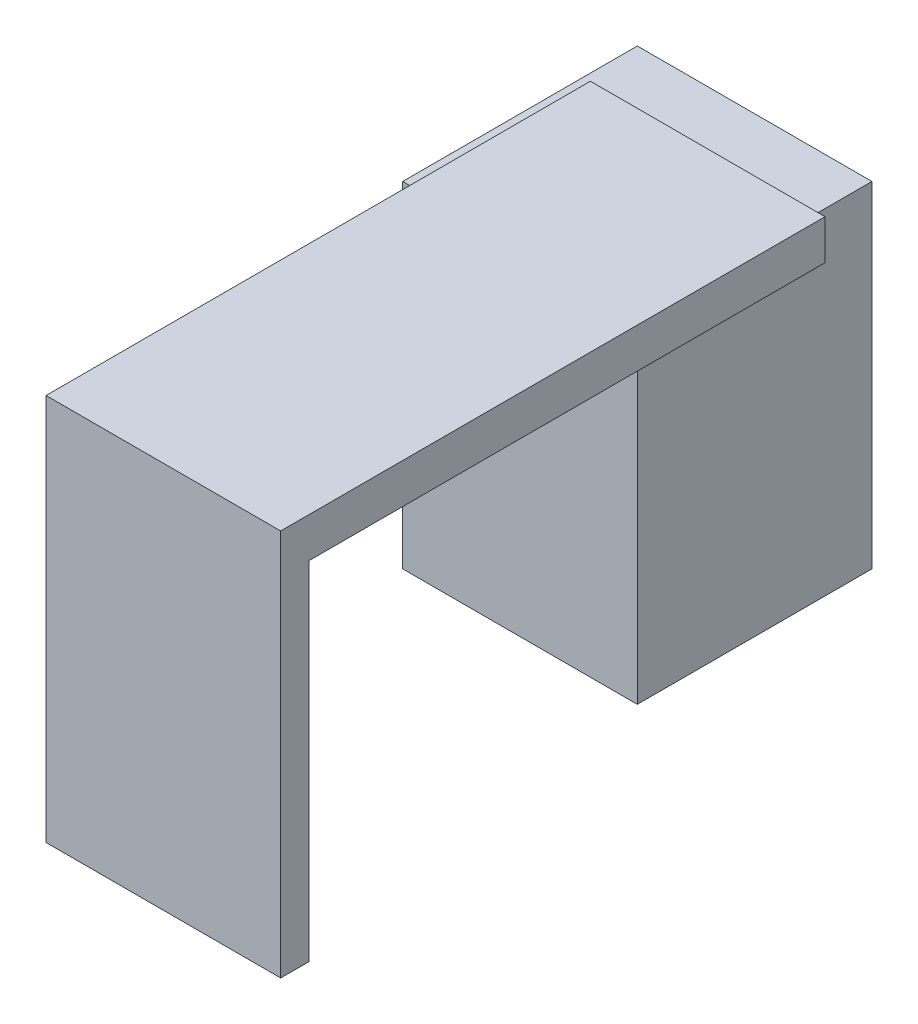
ISO-10303-21;
HEADER;
FILE_DESCRIPTION(('STEP AP214'),'2;1');
FILE_NAME('part.step','',(''),(''),'','','');
FILE_SCHEMA(('AUTOMOTIVE_DESIGN { 1 0 10303 214 1 1 1 1 }'));
ENDSEC;
DATA;
#1=APPLICATION_CONTEXT('core data for automotive mechanical design processes');
#2=APPLICATION_PROTOCOL_DEFINITION('international standard','automotive_design',2000,#1);
#3=PRODUCT_CONTEXT('',#1,'mechanical');
#4=PRODUCT('Part','Part','',(#3));
#5=PRODUCT_RELATED_PRODUCT_CATEGORY('part','',(#4));
#6=PRODUCT_DEFINITION_FORMATION('','',#4);
#7=PRODUCT_DEFINITION_CONTEXT('part definition',#1,'design');
#8=PRODUCT_DEFINITION('design','',#6,#7);
#9=PRODUCT_DEFINITION_SHAPE('','',#8);
#10=(LENGTH_UNIT() NAMED_UNIT(*) SI_UNIT(.MILLI.,.METRE.));
#11=(NAMED_UNIT(*) PLANE_ANGLE_UNIT() SI_UNIT($,.RADIAN.));
#12=(NAMED_UNIT(*) SI_UNIT($,.STERADIAN.) SOLID_ANGLE_UNIT());
#13=UNCERTAINTY_MEASURE_WITH_UNIT(LENGTH_MEASURE(1.E-05),#10,'distance_accuracy_value','');
#14=(GEOMETRIC_REPRESENTATION_CONTEXT(3) GLOBAL_UNCERTAINTY_ASSIGNED_CONTEXT((#13)) GLOBAL_UNIT_ASSIGNED_CONTEXT((#10,
#11,#12)) REPRESENTATION_CONTEXT('',''));
#15=CARTESIAN_POINT('',(0.,0.,0.));
#16=DIRECTION('',(0.,0.,1.));
#17=DIRECTION('',(1.,0.,0.));
#18=AXIS2_PLACEMENT_3D('',#15,#16,#17);
#19=CARTESIAN_POINT('',(250.,740.,-1160.));
#20=DIRECTION('',(0.,-1.,0.));
#21=DIRECTION('',(0.,0.,-1.));
#22=AXIS2_PLACEMENT_3D('',#19,#20,#21);
#23=PLANE('',#22);
#24=DIRECTION('',(0.,0.,-1.));
#25=VECTOR('',#24,1.);
#26=CARTESIAN_POINT('',(150.,740.,0.));
#27=LINE('',#26,#25);
#28=CARTESIAN_POINT('',(150.,740.,-860.));
#29=VERTEX_POINT('',#28);
#30=CARTESIAN_POINT('',(150.,740.,-1160.));
#31=VERTEX_POINT('',#30);
#32=EDGE_CURVE('E205',#29,#31,#27,.T.);
#33=ORIENTED_EDGE('',*,*,#32,.T.);
#34=DIRECTION('',(-1.,0.,0.));
#35=VECTOR('',#34,1.);
#36=CARTESIAN_POINT('',(250.,740.,-1160.));
#37=LINE('',#36,#35);
#38=CARTESIAN_POINT('',(250.,740.,-1160.));
#39=VERTEX_POINT('',#38);
#40=EDGE_CURVE('E11',#39,#31,#37,.T.);
#41=ORIENTED_EDGE('',*,*,#40,.F.);
#42=DIRECTION('',(0.,0.,1.));
#43=VECTOR('',#42,1.);
#44=CARTESIAN_POINT('',(250.,740.,-1160.));
#45=LINE('',#44,#43);
#46=CARTESIAN_POINT('',(250.,740.,-60.0000000000001));
#47=VERTEX_POINT('',#46);
#48=EDGE_CURVE('E151',#39,#47,#45,.T.);
#49=ORIENTED_EDGE('',*,*,#48,.T.);
#50=DIRECTION('',(-1.,0.,0.));
#51=VECTOR('',#50,1.);
#52=CARTESIAN_POINT('',(250.,740.,-60.0000000000001));
#53=LINE('',#52,#51);
#54=CARTESIAN_POINT('',(-250.,740.,-60.0000000000001));
#55=VERTEX_POINT('',#54);
#56=EDGE_CURVE('E38',#47,#55,#53,.T.);
#57=ORIENTED_EDGE('',*,*,#56,.T.);
#58=DIRECTION('',(0.,0.,1.));
#59=VECTOR('',#58,1.);
#60=CARTESIAN_POINT('',(-250.,740.,-1160.));
#61=LINE('',#60,#59);
#62=CARTESIAN_POINT('',(-250.,740.,-860.));
#63=VERTEX_POINT('',#62);
#64=EDGE_CURVE('E233',#63,#55,#61,.T.);
#65=ORIENTED_EDGE('',*,*,#64,.F.);
#66=DIRECTION('',(-1.,0.,0.));
#67=VECTOR('',#66,1.);
#68=CARTESIAN_POINT('',(0.,740.,-860.));
#69=LINE('',#68,#67);
#70=EDGE_CURVE('E51',#29,#63,#69,.T.);
#71=ORIENTED_EDGE('',*,*,#70,.F.);
#72=EDGE_LOOP('',(#33,#41,#49,#57,#65,#71));
#73=FACE_BOUND('',#72,.T.);
#74=ADVANCED_FACE('F35',(#73),#23,.T.);
#75=CARTESIAN_POINT('',(250.,800.,-1160.));
#76=DIRECTION('',(0.,0.,-1.));
#77=DIRECTION('',(-1.,0.,0.));
#78=AXIS2_PLACEMENT_3D('',#75,#76,#77);
#79=PLANE('',#78);
#80=DIRECTION('',(0.,-1.,0.));
#81=VECTOR('',#80,1.);
#82=CARTESIAN_POINT('',(-250.,800.,-1160.));
#83=LINE('',#82,#81);
#84=CARTESIAN_POINT('',(-250.,825.,-1160.));
#85=VERTEX_POINT('',#84);
#86=CARTESIAN_POINT('',(-250.,740.,-1160.));
#87=VERTEX_POINT('',#86);
#88=EDGE_CURVE('E144',#85,#87,#83,.T.);
#89=ORIENTED_EDGE('',*,*,#88,.F.);
#90=DIRECTION('',(-1.,0.,0.));
#91=VECTOR('',#90,1.);
#92=CARTESIAN_POINT('',(0.,825.,-1160.));
#93=LINE('',#92,#91);
#94=CARTESIAN_POINT('',(250.,825.,-1160.));
#95=VERTEX_POINT('',#94);
#96=EDGE_CURVE('E149',#95,#85,#93,.T.);
#97=ORIENTED_EDGE('',*,*,#96,.F.);
#98=DIRECTION('',(0.,-1.,0.));
#99=VECTOR('',#98,1.);
#100=CARTESIAN_POINT('',(250.,800.,-1160.));
#101=LINE('',#100,#99);
#102=EDGE_CURVE('E244',#95,#39,#101,.T.);
#103=ORIENTED_EDGE('',*,*,#102,.T.);
#104=ORIENTED_EDGE('',*,*,#40,.T.);
#105=DIRECTION('',(-1.,0.,0.));
#106=VECTOR('',#105,1.);
#107=CARTESIAN_POINT('',(250.,740.,-1160.));
#108=LINE('',#107,#106);
#109=EDGE_CURVE('E59',#31,#87,#108,.T.);
#110=ORIENTED_EDGE('',*,*,#109,.T.);
#111=EDGE_LOOP('',(#89,#97,#103,#104,#110));
#112=FACE_BOUND('',#111,.T.);
#113=ADVANCED_FACE('F146',(#112),#79,.T.);
#114=CARTESIAN_POINT('',(250.,0.,0.));
#115=DIRECTION('',(0.,0.,1.));
#116=DIRECTION('',(1.,0.,0.));
#117=AXIS2_PLACEMENT_3D('',#114,#115,#116);
#118=PLANE('',#117);
#119=DIRECTION('',(0.,1.,0.));
#120=VECTOR('',#119,1.);
#121=CARTESIAN_POINT('',(-250.,0.,0.));
#122=LINE('',#121,#120);
#123=CARTESIAN_POINT('',(-250.,0.,0.));
#124=VERTEX_POINT('',#123);
#125=CARTESIAN_POINT('',(-250.,825.,0.));
#126=VERTEX_POINT('',#125);
#127=EDGE_CURVE('E152',#124,#126,#122,.T.);
#128=ORIENTED_EDGE('',*,*,#127,.F.);
#129=DIRECTION('',(-1.,0.,0.));
#130=VECTOR('',#129,1.);
#131=CARTESIAN_POINT('',(250.,0.,0.));
#132=LINE('',#131,#130);
#133=CARTESIAN_POINT('',(250.,0.,0.));
#134=VERTEX_POINT('',#133);
#135=EDGE_CURVE('E43',#134,#124,#132,.T.);
#136=ORIENTED_EDGE('',*,*,#135,.F.);
#137=DIRECTION('',(0.,1.,0.));
#138=VECTOR('',#137,1.);
#139=CARTESIAN_POINT('',(250.,0.,0.));
#140=LINE('',#139,#138);
#141=CARTESIAN_POINT('',(250.,825.,0.));
#142=VERTEX_POINT('',#141);
#143=EDGE_CURVE('E242',#134,#142,#140,.T.);
#144=ORIENTED_EDGE('',*,*,#143,.T.);
#145=DIRECTION('',(1.,0.,0.));
#146=VECTOR('',#145,1.);
#147=CARTESIAN_POINT('',(0.,825.,0.));
#148=LINE('',#147,#146);
#149=EDGE_CURVE('E162',#126,#142,#148,.T.);
#150=ORIENTED_EDGE('',*,*,#149,.F.);
#151=EDGE_LOOP('',(#128,#136,#144,#150));
#152=FACE_BOUND('',#151,.T.);
#153=ADVANCED_FACE('F282',(#152),#118,.T.);
#154=CARTESIAN_POINT('',(250.,0.,-60.0000000000001));
#155=DIRECTION('',(0.,-1.,0.));
#156=DIRECTION('',(0.,0.,-1.));
#157=AXIS2_PLACEMENT_3D('',#154,#155,#156);
#158=PLANE('',#157);
#159=DIRECTION('',(0.,0.,1.));
#160=VECTOR('',#159,1.);
#161=CARTESIAN_POINT('',(-250.,0.,-60.0000000000001));
#162=LINE('',#161,#160);
#163=CARTESIAN_POINT('',(-250.,0.,-60.0000000000001));
#164=VERTEX_POINT('',#163);
#165=EDGE_CURVE('E251',#164,#124,#162,.T.);
#166=ORIENTED_EDGE('',*,*,#165,.F.);
#167=DIRECTION('',(-1.,0.,0.));
#168=VECTOR('',#167,1.);
#169=CARTESIAN_POINT('',(250.,0.,-60.0000000000001));
#170=LINE('',#169,#168);
#171=CARTESIAN_POINT('',(250.,0.,-60.0000000000001));
#172=VERTEX_POINT('',#171);
#173=EDGE_CURVE('E254',#172,#164,#170,.T.);
#174=ORIENTED_EDGE('',*,*,#173,.F.);
#175=DIRECTION('',(0.,0.,1.));
#176=VECTOR('',#175,1.);
#177=CARTESIAN_POINT('',(250.,0.,-60.0000000000001));
#178=LINE('',#177,#176);
#179=EDGE_CURVE('E239',#172,#134,#178,.T.);
#180=ORIENTED_EDGE('',*,*,#179,.T.);
#181=ORIENTED_EDGE('',*,*,#135,.T.);
#182=EDGE_LOOP('',(#166,#174,#180,#181));
#183=FACE_BOUND('',#182,.T.);
#184=ADVANCED_FACE('F280',(#183),#158,.T.);
#185=CARTESIAN_POINT('',(250.,740.,-60.0000000000001));
#186=DIRECTION('',(0.,0.,-1.));
#187=DIRECTION('',(0.,1.,0.));
#188=AXIS2_PLACEMENT_3D('',#185,#186,#187);
#189=PLANE('',#188);
#190=DIRECTION('',(0.,-1.,0.));
#191=VECTOR('',#190,1.);
#192=CARTESIAN_POINT('',(-250.,740.,-60.0000000000001));
#193=LINE('',#192,#191);
#194=EDGE_CURVE('E248',#55,#164,#193,.T.);
#195=ORIENTED_EDGE('',*,*,#194,.F.);
#196=ORIENTED_EDGE('',*,*,#56,.F.);
#197=DIRECTION('',(0.,-1.,0.));
#198=VECTOR('',#197,1.);
#199=CARTESIAN_POINT('',(250.,740.,-60.0000000000001));
#200=LINE('',#199,#198);
#201=EDGE_CURVE('E236',#47,#172,#200,.T.);
#202=ORIENTED_EDGE('',*,*,#201,.T.);
#203=ORIENTED_EDGE('',*,*,#173,.T.);
#204=EDGE_LOOP('',(#195,#196,#202,#203));
#205=FACE_BOUND('',#204,.T.);
#206=ADVANCED_FACE('F262',(#205),#189,.T.);
#207=CARTESIAN_POINT('',(250.,0.,0.));
#208=DIRECTION('',(1.,0.,0.));
#209=DIRECTION('',(0.,0.,-1.));
#210=AXIS2_PLACEMENT_3D('',#207,#208,#209);
#211=PLANE('',#210);
#212=ORIENTED_EDGE('',*,*,#48,.F.);
#213=ORIENTED_EDGE('',*,*,#102,.F.);
#214=DIRECTION('',(0.,0.,-1.));
#215=VECTOR('',#214,1.);
#216=CARTESIAN_POINT('',(250.,825.,0.));
#217=LINE('',#216,#215);
#218=EDGE_CURVE('E167',#142,#95,#217,.T.);
#219=ORIENTED_EDGE('',*,*,#218,.F.);
#220=ORIENTED_EDGE('',*,*,#143,.F.);
#221=ORIENTED_EDGE('',*,*,#179,.F.);
#222=ORIENTED_EDGE('',*,*,#201,.F.);
#223=EDGE_LOOP('',(#212,#213,#219,#220,#221,#222));
#224=FACE_BOUND('',#223,.T.);
#225=ADVANCED_FACE('F276',(#224),#211,.T.);
#226=CARTESIAN_POINT('',(-250.,0.,0.));
#227=DIRECTION('',(1.,0.,0.));
#228=DIRECTION('',(0.,0.,-1.));
#229=AXIS2_PLACEMENT_3D('',#226,#227,#228);
#230=PLANE('',#229);
#231=EDGE_CURVE('E246',#87,#63,#61,.T.);
#232=ORIENTED_EDGE('',*,*,#231,.T.);
#233=ORIENTED_EDGE('',*,*,#64,.T.);
#234=ORIENTED_EDGE('',*,*,#194,.T.);
#235=ORIENTED_EDGE('',*,*,#165,.T.);
#236=ORIENTED_EDGE('',*,*,#127,.T.);
#237=DIRECTION('',(0.,0.,1.));
#238=VECTOR('',#237,1.);
#239=CARTESIAN_POINT('',(-250.,825.,0.));
#240=LINE('',#239,#238);
#241=EDGE_CURVE('E155',#85,#126,#240,.T.);
#242=ORIENTED_EDGE('',*,*,#241,.F.);
#243=ORIENTED_EDGE('',*,*,#88,.T.);
#244=EDGE_LOOP('',(#232,#233,#234,#235,#236,#242,#243));
#245=FACE_BOUND('',#244,.T.);
#246=ADVANCED_FACE('F156',(#245),#230,.F.);
#247=CARTESIAN_POINT('',(250.,740.,-1160.));
#248=DIRECTION('',(0.,-1.,0.));
#249=DIRECTION('',(0.,0.,-1.));
#250=AXIS2_PLACEMENT_3D('',#247,#248,#249);
#251=PLANE('',#250);
#252=ORIENTED_EDGE('',*,*,#109,.F.);
#253=CARTESIAN_POINT('',(150.,740.,-1360.));
#254=VERTEX_POINT('',#253);
#255=EDGE_CURVE('E175',#31,#254,#27,.T.);
#256=ORIENTED_EDGE('',*,*,#255,.T.);
#257=DIRECTION('',(-1.,0.,0.));
#258=VECTOR('',#257,1.);
#259=CARTESIAN_POINT('',(0.,740.,-1360.));
#260=LINE('',#259,#258);
#261=CARTESIAN_POINT('',(-350.,740.,-1360.));
#262=VERTEX_POINT('',#261);
#263=EDGE_CURVE('E207',#254,#262,#260,.T.);
#264=ORIENTED_EDGE('',*,*,#263,.T.);
#265=DIRECTION('',(0.,0.,-1.));
#266=VECTOR('',#265,1.);
#267=CARTESIAN_POINT('',(-350.,740.,0.));
#268=LINE('',#267,#266);
#269=CARTESIAN_POINT('',(-350.,740.,-860.));
#270=VERTEX_POINT('',#269);
#271=EDGE_CURVE('E201',#270,#262,#268,.T.);
#272=ORIENTED_EDGE('',*,*,#271,.F.);
#273=EDGE_CURVE('E193',#63,#270,#69,.T.);
#274=ORIENTED_EDGE('',*,*,#273,.F.);
#275=ORIENTED_EDGE('',*,*,#231,.F.);
#276=EDGE_LOOP('',(#252,#256,#264,#272,#274,#275));
#277=FACE_BOUND('',#276,.T.);
#278=ADVANCED_FACE('F263',(#277),#251,.F.);
#279=CARTESIAN_POINT('',(150.,1447.10678118655,0.));
#280=DIRECTION('',(1.,0.,0.));
#281=DIRECTION('',(0.,0.,-1.));
#282=AXIS2_PLACEMENT_3D('',#279,#280,#281);
#283=PLANE('',#282);
#284=ORIENTED_EDGE('',*,*,#32,.F.);
#285=DIRECTION('',(0.,-1.,0.));
#286=VECTOR('',#285,1.);
#287=CARTESIAN_POINT('',(150.,1447.10678118655,-860.));
#288=LINE('',#287,#286);
#289=CARTESIAN_POINT('',(150.,25.,-860.));
#290=VERTEX_POINT('',#289);
#291=EDGE_CURVE('E180',#29,#290,#288,.T.);
#292=ORIENTED_EDGE('',*,*,#291,.T.);
#293=DIRECTION('',(0.,0.,1.));
#294=VECTOR('',#293,1.);
#295=CARTESIAN_POINT('',(150.,25.,0.));
#296=LINE('',#295,#294);
#297=CARTESIAN_POINT('',(150.,25.,-1360.));
#298=VERTEX_POINT('',#297);
#299=EDGE_CURVE('E188',#298,#290,#296,.T.);
#300=ORIENTED_EDGE('',*,*,#299,.F.);
#301=DIRECTION('',(0.,-1.,0.));
#302=VECTOR('',#301,1.);
#303=CARTESIAN_POINT('',(150.,1447.10678118655,-1360.));
#304=LINE('',#303,#302);
#305=EDGE_CURVE('E199',#254,#298,#304,.T.);
#306=ORIENTED_EDGE('',*,*,#305,.F.);
#307=ORIENTED_EDGE('',*,*,#255,.F.);
#308=EDGE_LOOP('',(#284,#292,#300,#306,#307));
#309=FACE_BOUND('',#308,.T.);
#310=ADVANCED_FACE('F272',(#309),#283,.T.);
#311=CARTESIAN_POINT('',(0.,1447.10678118655,-1360.));
#312=DIRECTION('',(0.,0.,-1.));
#313=DIRECTION('',(-1.,0.,0.));
#314=AXIS2_PLACEMENT_3D('',#311,#312,#313);
#315=PLANE('',#314);
#316=ORIENTED_EDGE('',*,*,#263,.F.);
#317=ORIENTED_EDGE('',*,*,#305,.T.);
#318=DIRECTION('',(1.,0.,0.));
#319=VECTOR('',#318,1.);
#320=CARTESIAN_POINT('',(0.,25.,-1360.));
#321=LINE('',#320,#319);
#322=CARTESIAN_POINT('',(-350.,25.,-1360.));
#323=VERTEX_POINT('',#322);
#324=EDGE_CURVE('E184',#323,#298,#321,.T.);
#325=ORIENTED_EDGE('',*,*,#324,.F.);
#326=DIRECTION('',(0.,-1.,0.));
#327=VECTOR('',#326,1.);
#328=CARTESIAN_POINT('',(-350.,1447.10678118655,-1360.));
#329=LINE('',#328,#327);
#330=EDGE_CURVE('E194',#262,#323,#329,.T.);
#331=ORIENTED_EDGE('',*,*,#330,.F.);
#332=EDGE_LOOP('',(#316,#317,#325,#331));
#333=FACE_BOUND('',#332,.T.);
#334=ADVANCED_FACE('F397',(#333),#315,.T.);
#335=CARTESIAN_POINT('',(-350.,1447.10678118655,0.));
#336=DIRECTION('',(1.,0.,0.));
#337=DIRECTION('',(0.,0.,-1.));
#338=AXIS2_PLACEMENT_3D('',#335,#336,#337);
#339=PLANE('',#338);
#340=DIRECTION('',(0.,-1.,0.));
#341=VECTOR('',#340,1.);
#342=CARTESIAN_POINT('',(-350.,1447.10678118655,-860.));
#343=LINE('',#342,#341);
#344=CARTESIAN_POINT('',(-350.,25.,-860.));
#345=VERTEX_POINT('',#344);
#346=EDGE_CURVE('E189',#270,#345,#343,.T.);
#347=ORIENTED_EDGE('',*,*,#346,.F.);
#348=ORIENTED_EDGE('',*,*,#271,.T.);
#349=ORIENTED_EDGE('',*,*,#330,.T.);
#350=DIRECTION('',(0.,0.,1.));
#351=VECTOR('',#350,1.);
#352=CARTESIAN_POINT('',(-350.,25.,0.));
#353=LINE('',#352,#351);
#354=EDGE_CURVE('E190',#323,#345,#353,.T.);
#355=ORIENTED_EDGE('',*,*,#354,.T.);
#356=EDGE_LOOP('',(#347,#348,#349,#355));
#357=FACE_BOUND('',#356,.T.);
#358=ADVANCED_FACE('F390',(#357),#339,.F.);
#359=CARTESIAN_POINT('',(0.,1447.10678118655,-860.));
#360=DIRECTION('',(0.,0.,-1.));
#361=DIRECTION('',(-1.,0.,0.));
#362=AXIS2_PLACEMENT_3D('',#359,#360,#361);
#363=PLANE('',#362);
#364=ORIENTED_EDGE('',*,*,#291,.F.);
#365=ORIENTED_EDGE('',*,*,#70,.T.);
#366=ORIENTED_EDGE('',*,*,#273,.T.);
#367=ORIENTED_EDGE('',*,*,#346,.T.);
#368=DIRECTION('',(1.,0.,0.));
#369=VECTOR('',#368,1.);
#370=CARTESIAN_POINT('',(0.,25.,-860.));
#371=LINE('',#370,#369);
#372=EDGE_CURVE('E185',#345,#290,#371,.T.);
#373=ORIENTED_EDGE('',*,*,#372,.T.);
#374=EDGE_LOOP('',(#364,#365,#366,#367,#373));
#375=FACE_BOUND('',#374,.T.);
#376=ADVANCED_FACE('F268',(#375),#363,.F.);
#377=CARTESIAN_POINT('',(0.,25.,0.));
#378=DIRECTION('',(0.,1.,0.));
#379=DIRECTION('',(0.,0.,1.));
#380=AXIS2_PLACEMENT_3D('',#377,#378,#379);
#381=PLANE('',#380);
#382=ORIENTED_EDGE('',*,*,#299,.T.);
#383=ORIENTED_EDGE('',*,*,#372,.F.);
#384=ORIENTED_EDGE('',*,*,#354,.F.);
#385=ORIENTED_EDGE('',*,*,#324,.T.);
#386=EDGE_LOOP('',(#382,#383,#384,#385));
#387=FACE_BOUND('',#386,.T.);
#388=DIRECTION('',(0.,0.,1.));
#389=VECTOR('',#388,1.);
#390=CARTESIAN_POINT('',(-325.,25.,0.));
#391=LINE('',#390,#389);
#392=CARTESIAN_POINT('',(-325.,25.,-1335.));
#393=VERTEX_POINT('',#392);
#394=CARTESIAN_POINT('',(-325.,25.,-885.));
#395=VERTEX_POINT('',#394);
#396=EDGE_CURVE('E176',#393,#395,#391,.T.);
#397=ORIENTED_EDGE('',*,*,#396,.T.);
#398=DIRECTION('',(1.,0.,0.));
#399=VECTOR('',#398,1.);
#400=CARTESIAN_POINT('',(0.,25.,-885.));
#401=LINE('',#400,#399);
#402=CARTESIAN_POINT('',(125.,24.9999999999999,-885.));
#403=VERTEX_POINT('',#402);
#404=EDGE_CURVE('E173',#395,#403,#401,.T.);
#405=ORIENTED_EDGE('',*,*,#404,.T.);
#406=DIRECTION('',(0.,0.,1.));
#407=VECTOR('',#406,1.);
#408=CARTESIAN_POINT('',(125.,25.,0.));
#409=LINE('',#408,#407);
#410=CARTESIAN_POINT('',(125.,25.,-1335.));
#411=VERTEX_POINT('',#410);
#412=EDGE_CURVE('E177',#411,#403,#409,.T.);
#413=ORIENTED_EDGE('',*,*,#412,.F.);
#414=DIRECTION('',(1.,0.,0.));
#415=VECTOR('',#414,1.);
#416=CARTESIAN_POINT('',(0.,25.,-1335.));
#417=LINE('',#416,#415);
#418=EDGE_CURVE('E172',#393,#411,#417,.T.);
#419=ORIENTED_EDGE('',*,*,#418,.F.);
#420=EDGE_LOOP('',(#397,#405,#413,#419));
#421=FACE_BOUND('',#420,.T.);
#422=ADVANCED_FACE('F375',(#387,#421),#381,.F.);
#423=CARTESIAN_POINT('',(0.,0.,0.));
#424=DIRECTION('',(0.,1.,0.));
#425=DIRECTION('',(0.,0.,1.));
#426=AXIS2_PLACEMENT_3D('',#423,#424,#425);
#427=PLANE('',#426);
#428=DIRECTION('',(1.,0.,0.));
#429=VECTOR('',#428,1.);
#430=CARTESIAN_POINT('',(0.,0.,-1335.));
#431=LINE('',#430,#429);
#432=CARTESIAN_POINT('',(-325.,0.,-1335.));
#433=VERTEX_POINT('',#432);
#434=CARTESIAN_POINT('',(125.,0.,-1335.));
#435=VERTEX_POINT('',#434);
#436=EDGE_CURVE('E209',#433,#435,#431,.T.);
#437=ORIENTED_EDGE('',*,*,#436,.T.);
#438=DIRECTION('',(0.,0.,1.));
#439=VECTOR('',#438,1.);
#440=CARTESIAN_POINT('',(125.,0.,0.));
#441=LINE('',#440,#439);
#442=CARTESIAN_POINT('',(125.,0.,-885.));
#443=VERTEX_POINT('',#442);
#444=EDGE_CURVE('E221',#435,#443,#441,.T.);
#445=ORIENTED_EDGE('',*,*,#444,.T.);
#446=DIRECTION('',(1.,0.,0.));
#447=VECTOR('',#446,1.);
#448=CARTESIAN_POINT('',(0.,0.,-885.));
#449=LINE('',#448,#447);
#450=CARTESIAN_POINT('',(-325.,0.,-885.));
#451=VERTEX_POINT('',#450);
#452=EDGE_CURVE('E218',#451,#443,#449,.T.);
#453=ORIENTED_EDGE('',*,*,#452,.F.);
#454=DIRECTION('',(0.,0.,1.));
#455=VECTOR('',#454,1.);
#456=CARTESIAN_POINT('',(-325.,0.,0.));
#457=LINE('',#456,#455);
#458=EDGE_CURVE('E215',#433,#451,#457,.T.);
#459=ORIENTED_EDGE('',*,*,#458,.F.);
#460=EDGE_LOOP('',(#437,#445,#453,#459));
#461=FACE_BOUND('',#460,.T.);
#462=ADVANCED_FACE('F367',(#461),#427,.F.);
#463=CARTESIAN_POINT('',(125.,1376.39610306789,0.));
#464=DIRECTION('',(1.,0.,0.));
#465=DIRECTION('',(0.,0.,-1.));
#466=AXIS2_PLACEMENT_3D('',#463,#464,#465);
#467=PLANE('',#466);
#468=DIRECTION('',(0.,-1.,0.));
#469=VECTOR('',#468,1.);
#470=CARTESIAN_POINT('',(125.,1376.39610306789,-1335.));
#471=LINE('',#470,#469);
#472=EDGE_CURVE('E224',#411,#435,#471,.T.);
#473=ORIENTED_EDGE('',*,*,#472,.F.);
#474=ORIENTED_EDGE('',*,*,#412,.T.);
#475=DIRECTION('',(0.,-1.,0.));
#476=VECTOR('',#475,1.);
#477=CARTESIAN_POINT('',(125.,1376.39610306789,-885.));
#478=LINE('',#477,#476);
#479=EDGE_CURVE('E226',#403,#443,#478,.T.);
#480=ORIENTED_EDGE('',*,*,#479,.T.);
#481=ORIENTED_EDGE('',*,*,#444,.F.);
#482=EDGE_LOOP('',(#473,#474,#480,#481));
#483=FACE_BOUND('',#482,.T.);
#484=ADVANCED_FACE('F359',(#483),#467,.T.);
#485=CARTESIAN_POINT('',(0.,1376.39610306789,-885.));
#486=DIRECTION('',(0.,0.,-1.));
#487=DIRECTION('',(-1.,0.,0.));
#488=AXIS2_PLACEMENT_3D('',#485,#486,#487);
#489=PLANE('',#488);
#490=ORIENTED_EDGE('',*,*,#404,.F.);
#491=DIRECTION('',(0.,-1.,0.));
#492=VECTOR('',#491,1.);
#493=CARTESIAN_POINT('',(-325.,1376.39610306789,-885.));
#494=LINE('',#493,#492);
#495=EDGE_CURVE('E228',#395,#451,#494,.T.);
#496=ORIENTED_EDGE('',*,*,#495,.T.);
#497=ORIENTED_EDGE('',*,*,#452,.T.);
#498=ORIENTED_EDGE('',*,*,#479,.F.);
#499=EDGE_LOOP('',(#490,#496,#497,#498));
#500=FACE_BOUND('',#499,.T.);
#501=ADVANCED_FACE('F351',(#500),#489,.F.);
#502=CARTESIAN_POINT('',(-325.,1376.39610306789,0.));
#503=DIRECTION('',(1.,0.,0.));
#504=DIRECTION('',(0.,0.,-1.));
#505=AXIS2_PLACEMENT_3D('',#502,#503,#504);
#506=PLANE('',#505);
#507=ORIENTED_EDGE('',*,*,#396,.F.);
#508=DIRECTION('',(0.,-1.,0.));
#509=VECTOR('',#508,1.);
#510=CARTESIAN_POINT('',(-325.,1376.39610306789,-1335.));
#511=LINE('',#510,#509);
#512=EDGE_CURVE('E230',#393,#433,#511,.T.);
#513=ORIENTED_EDGE('',*,*,#512,.T.);
#514=ORIENTED_EDGE('',*,*,#458,.T.);
#515=ORIENTED_EDGE('',*,*,#495,.F.);
#516=EDGE_LOOP('',(#507,#513,#514,#515));
#517=FACE_BOUND('',#516,.T.);
#518=ADVANCED_FACE('F346',(#517),#506,.F.);
#519=CARTESIAN_POINT('',(0.,1376.39610306789,-1335.));
#520=DIRECTION('',(0.,0.,-1.));
#521=DIRECTION('',(-1.,0.,0.));
#522=AXIS2_PLACEMENT_3D('',#519,#520,#521);
#523=PLANE('',#522);
#524=ORIENTED_EDGE('',*,*,#512,.F.);
#525=ORIENTED_EDGE('',*,*,#418,.T.);
#526=ORIENTED_EDGE('',*,*,#472,.T.);
#527=ORIENTED_EDGE('',*,*,#436,.F.);
#528=EDGE_LOOP('',(#524,#525,#526,#527));
#529=FACE_BOUND('',#528,.T.);
#530=ADVANCED_FACE('F307',(#529),#523,.T.);
#531=CARTESIAN_POINT('',(0.,825.,0.));
#532=DIRECTION('',(0.,1.,0.));
#533=DIRECTION('',(0.,0.,1.));
#534=AXIS2_PLACEMENT_3D('',#531,#532,#533);
#535=PLANE('',#534);
#536=ORIENTED_EDGE('',*,*,#96,.T.);
#537=ORIENTED_EDGE('',*,*,#241,.T.);
#538=ORIENTED_EDGE('',*,*,#149,.T.);
#539=ORIENTED_EDGE('',*,*,#218,.T.);
#540=EDGE_LOOP('',(#536,#537,#538,#539));
#541=FACE_BOUND('',#540,.T.);
#542=ADVANCED_FACE('F165',(#541),#535,.T.);
#543=CLOSED_SHELL('',(#74,#113,#153,#184,#206,#225,#246,#278,#310,#334,#358,#376,#422,#462,#484,
#501,#518,#530,#542));
#544=MANIFOLD_SOLID_BREP('B2',#543);
#545=ADVANCED_BREP_SHAPE_REPRESENTATION('',(#18,#544),#14);
#546=SHAPE_DEFINITION_REPRESENTATION(#9,#545);
ENDSEC;
END-ISO-10303-21;
